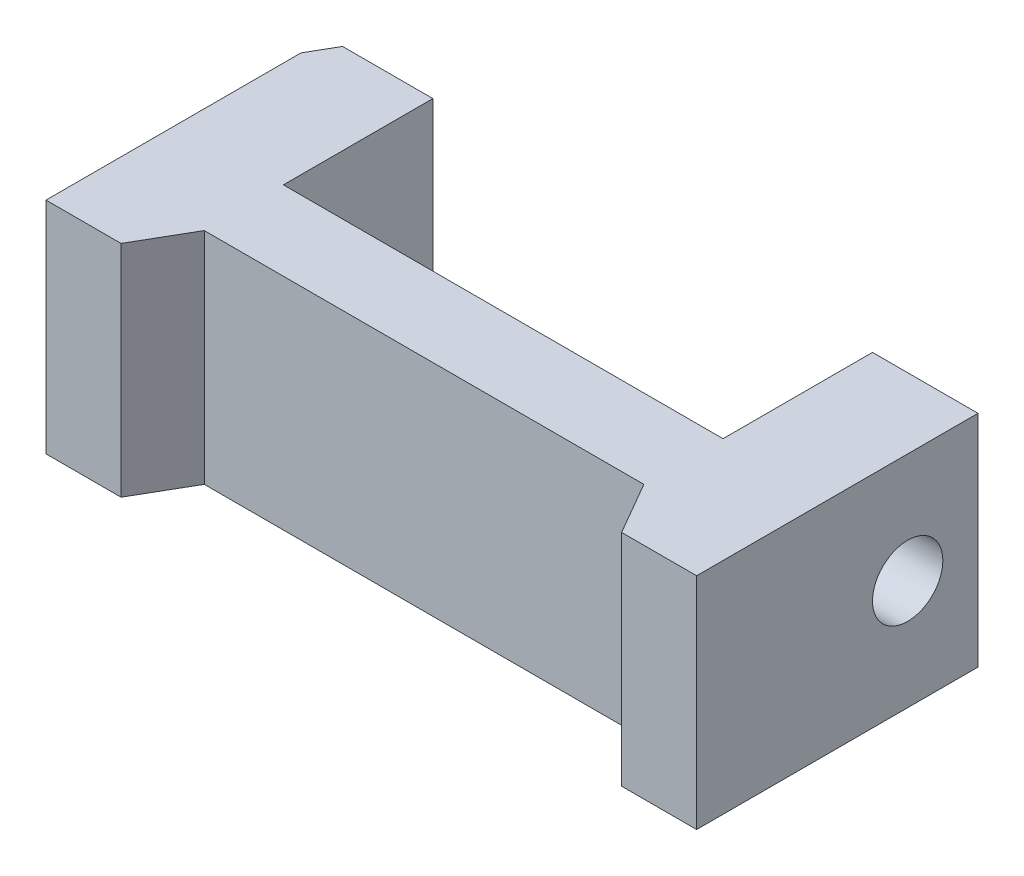
ISO-10303-21;
HEADER;
FILE_DESCRIPTION(('STEP AP214'),'2;1');
FILE_NAME('part.step','',(''),(''),'','','');
FILE_SCHEMA(('AUTOMOTIVE_DESIGN { 1 0 10303 214 1 1 1 1 }'));
ENDSEC;
DATA;
#1=APPLICATION_CONTEXT('core data for automotive mechanical design processes');
#2=APPLICATION_PROTOCOL_DEFINITION('international standard','automotive_design',2000,#1);
#3=PRODUCT_CONTEXT('',#1,'mechanical');
#4=PRODUCT('Part','Part','',(#3));
#5=PRODUCT_RELATED_PRODUCT_CATEGORY('part','',(#4));
#6=PRODUCT_DEFINITION_FORMATION('','',#4);
#7=PRODUCT_DEFINITION_CONTEXT('part definition',#1,'design');
#8=PRODUCT_DEFINITION('design','',#6,#7);
#9=PRODUCT_DEFINITION_SHAPE('','',#8);
#10=(LENGTH_UNIT() NAMED_UNIT(*) SI_UNIT(.MILLI.,.METRE.));
#11=(NAMED_UNIT(*) PLANE_ANGLE_UNIT() SI_UNIT($,.RADIAN.));
#12=(NAMED_UNIT(*) SI_UNIT($,.STERADIAN.) SOLID_ANGLE_UNIT());
#13=UNCERTAINTY_MEASURE_WITH_UNIT(LENGTH_MEASURE(1.E-05),#10,'distance_accuracy_value','');
#14=(GEOMETRIC_REPRESENTATION_CONTEXT(3) GLOBAL_UNCERTAINTY_ASSIGNED_CONTEXT((#13)) GLOBAL_UNIT_ASSIGNED_CONTEXT((#10,
#11,#12)) REPRESENTATION_CONTEXT('',''));
#15=CARTESIAN_POINT('',(0.,0.,0.));
#16=DIRECTION('',(0.,0.,1.));
#17=DIRECTION('',(1.,0.,0.));
#18=AXIS2_PLACEMENT_3D('',#15,#16,#17);
#19=CARTESIAN_POINT('',(-26.4593597471312,25.,-4.));
#20=DIRECTION('',(0.,0.,-1.));
#21=DIRECTION('',(-1.,0.,0.));
#22=AXIS2_PLACEMENT_3D('',#19,#20,#21);
#23=PLANE('',#22);
#24=DIRECTION('',(1.,0.,0.));
#25=VECTOR('',#24,1.);
#26=CARTESIAN_POINT('',(-26.4593597471312,0.,-4.));
#27=LINE('',#26,#25);
#28=CARTESIAN_POINT('',(-34.9952581319934,0.,-3.99999999999999));
#29=VERTEX_POINT('',#28);
#30=CARTESIAN_POINT('',(-26.4593597471312,0.,-4.));
#31=VERTEX_POINT('',#30);
#32=EDGE_CURVE('E170',#29,#31,#27,.T.);
#33=ORIENTED_EDGE('',*,*,#32,.T.);
#34=DIRECTION('',(0.,-1.,0.));
#35=VECTOR('',#34,1.);
#36=CARTESIAN_POINT('',(-26.4593597471312,25.,-4.));
#37=LINE('',#36,#35);
#38=CARTESIAN_POINT('',(-26.4593597471312,25.,-4.));
#39=VERTEX_POINT('',#38);
#40=EDGE_CURVE('E11',#39,#31,#37,.T.);
#41=ORIENTED_EDGE('',*,*,#40,.F.);
#42=DIRECTION('',(1.,0.,0.));
#43=VECTOR('',#42,1.);
#44=CARTESIAN_POINT('',(-26.4593597471312,25.,-4.));
#45=LINE('',#44,#43);
#46=CARTESIAN_POINT('',(-34.9952581319934,25.,-3.99999999999999));
#47=VERTEX_POINT('',#46);
#48=EDGE_CURVE('E208',#47,#39,#45,.T.);
#49=ORIENTED_EDGE('',*,*,#48,.F.);
#50=DIRECTION('',(0.,-1.,0.));
#51=VECTOR('',#50,1.);
#52=CARTESIAN_POINT('',(-34.9952581319934,25.,-3.99999999999999));
#53=LINE('',#52,#51);
#54=EDGE_CURVE('E166',#47,#29,#53,.T.);
#55=ORIENTED_EDGE('',*,*,#54,.T.);
#56=EDGE_LOOP('',(#33,#41,#49,#55));
#57=FACE_BOUND('',#56,.T.);
#58=ADVANCED_FACE('F39',(#57),#23,.F.);
#59=CARTESIAN_POINT('',(-22.9952581319934,25.,-10.));
#60=DIRECTION('',(-0.866025403784442,0.,-0.499999999999994));
#61=DIRECTION('',(-0.499999999999994,0.,0.866025403784442));
#62=AXIS2_PLACEMENT_3D('',#59,#60,#61);
#63=PLANE('',#62);
#64=DIRECTION('',(0.499999999999994,0.,-0.866025403784442));
#65=VECTOR('',#64,1.);
#66=CARTESIAN_POINT('',(-22.9952581319934,0.,-10.));
#67=LINE('',#66,#65);
#68=CARTESIAN_POINT('',(-22.9952581319934,0.,-10.));
#69=VERTEX_POINT('',#68);
#70=EDGE_CURVE('E174',#31,#69,#67,.T.);
#71=ORIENTED_EDGE('',*,*,#70,.T.);
#72=DIRECTION('',(0.,-1.,0.));
#73=VECTOR('',#72,1.);
#74=CARTESIAN_POINT('',(-22.9952581319934,25.,-10.));
#75=LINE('',#74,#73);
#76=CARTESIAN_POINT('',(-22.9952581319934,25.,-10.));
#77=VERTEX_POINT('',#76);
#78=EDGE_CURVE('E48',#77,#69,#75,.T.);
#79=ORIENTED_EDGE('',*,*,#78,.F.);
#80=DIRECTION('',(0.499999999999994,0.,-0.866025403784442));
#81=VECTOR('',#80,1.);
#82=CARTESIAN_POINT('',(-22.9952581319934,25.,-10.));
#83=LINE('',#82,#81);
#84=EDGE_CURVE('E114',#39,#77,#83,.T.);
#85=ORIENTED_EDGE('',*,*,#84,.F.);
#86=ORIENTED_EDGE('',*,*,#40,.T.);
#87=EDGE_LOOP('',(#71,#79,#85,#86));
#88=FACE_BOUND('',#87,.T.);
#89=ADVANCED_FACE('F309',(#88),#63,.F.);
#90=CARTESIAN_POINT('',(27.0047418680066,25.,-10.));
#91=DIRECTION('',(0.,0.,-1.));
#92=DIRECTION('',(-1.,0.,0.));
#93=AXIS2_PLACEMENT_3D('',#90,#91,#92);
#94=PLANE('',#93);
#95=DIRECTION('',(1.,0.,0.));
#96=VECTOR('',#95,1.);
#97=CARTESIAN_POINT('',(27.0047418680066,0.,-10.));
#98=LINE('',#97,#96);
#99=CARTESIAN_POINT('',(27.0047418680066,0.,-10.));
#100=VERTEX_POINT('',#99);
#101=EDGE_CURVE('E178',#69,#100,#98,.T.);
#102=ORIENTED_EDGE('',*,*,#101,.T.);
#103=DIRECTION('',(0.,-1.,0.));
#104=VECTOR('',#103,1.);
#105=CARTESIAN_POINT('',(27.0047418680066,25.,-10.));
#106=LINE('',#105,#104);
#107=CARTESIAN_POINT('',(27.0047418680066,25.,-10.));
#108=VERTEX_POINT('',#107);
#109=EDGE_CURVE('E239',#108,#100,#106,.T.);
#110=ORIENTED_EDGE('',*,*,#109,.F.);
#111=DIRECTION('',(1.,0.,0.));
#112=VECTOR('',#111,1.);
#113=CARTESIAN_POINT('',(27.0047418680066,25.,-10.));
#114=LINE('',#113,#112);
#115=EDGE_CURVE('E249',#77,#108,#114,.T.);
#116=ORIENTED_EDGE('',*,*,#115,.F.);
#117=ORIENTED_EDGE('',*,*,#78,.T.);
#118=EDGE_LOOP('',(#102,#110,#116,#117));
#119=FACE_BOUND('',#118,.T.);
#120=ADVANCED_FACE('F247',(#119),#94,.F.);
#121=CARTESIAN_POINT('',(30.4688434831443,25.,-4.));
#122=DIRECTION('',(0.866025403784441,0.,-0.499999999999996));
#123=DIRECTION('',(-0.499999999999996,0.,-0.866025403784441));
#124=AXIS2_PLACEMENT_3D('',#121,#122,#123);
#125=PLANE('',#124);
#126=DIRECTION('',(0.499999999999996,0.,0.866025403784441));
#127=VECTOR('',#126,1.);
#128=CARTESIAN_POINT('',(30.4688434831443,0.,-4.));
#129=LINE('',#128,#127);
#130=CARTESIAN_POINT('',(30.4688434831443,0.,-4.));
#131=VERTEX_POINT('',#130);
#132=EDGE_CURVE('E181',#100,#131,#129,.T.);
#133=ORIENTED_EDGE('',*,*,#132,.T.);
#134=DIRECTION('',(0.,-1.,0.));
#135=VECTOR('',#134,1.);
#136=CARTESIAN_POINT('',(30.4688434831443,25.,-4.));
#137=LINE('',#136,#135);
#138=CARTESIAN_POINT('',(30.4688434831443,25.,-4.));
#139=VERTEX_POINT('',#138);
#140=EDGE_CURVE('E235',#139,#131,#137,.T.);
#141=ORIENTED_EDGE('',*,*,#140,.F.);
#142=DIRECTION('',(0.499999999999996,0.,0.866025403784441));
#143=VECTOR('',#142,1.);
#144=CARTESIAN_POINT('',(30.4688434831443,25.,-4.));
#145=LINE('',#144,#143);
#146=EDGE_CURVE('E268',#108,#139,#145,.T.);
#147=ORIENTED_EDGE('',*,*,#146,.F.);
#148=ORIENTED_EDGE('',*,*,#109,.T.);
#149=EDGE_LOOP('',(#133,#141,#147,#148));
#150=FACE_BOUND('',#149,.T.);
#151=ADVANCED_FACE('F258',(#150),#125,.F.);
#152=CARTESIAN_POINT('',(39.0047418680066,25.,-4.));
#153=DIRECTION('',(0.,0.,-1.));
#154=DIRECTION('',(-1.,0.,0.));
#155=AXIS2_PLACEMENT_3D('',#152,#153,#154);
#156=PLANE('',#155);
#157=DIRECTION('',(1.,0.,0.));
#158=VECTOR('',#157,1.);
#159=CARTESIAN_POINT('',(39.0047418680066,0.,-4.));
#160=LINE('',#159,#158);
#161=CARTESIAN_POINT('',(39.0047418680066,0.,-4.));
#162=VERTEX_POINT('',#161);
#163=EDGE_CURVE('E184',#131,#162,#160,.T.);
#164=ORIENTED_EDGE('',*,*,#163,.T.);
#165=DIRECTION('',(0.,-1.,0.));
#166=VECTOR('',#165,1.);
#167=CARTESIAN_POINT('',(39.0047418680066,25.,-4.));
#168=LINE('',#167,#166);
#169=CARTESIAN_POINT('',(39.0047418680066,25.,-4.));
#170=VERTEX_POINT('',#169);
#171=EDGE_CURVE('E231',#170,#162,#168,.T.);
#172=ORIENTED_EDGE('',*,*,#171,.F.);
#173=DIRECTION('',(1.,0.,0.));
#174=VECTOR('',#173,1.);
#175=CARTESIAN_POINT('',(39.0047418680066,25.,-4.));
#176=LINE('',#175,#174);
#177=EDGE_CURVE('E264',#139,#170,#176,.T.);
#178=ORIENTED_EDGE('',*,*,#177,.F.);
#179=ORIENTED_EDGE('',*,*,#140,.T.);
#180=EDGE_LOOP('',(#164,#172,#178,#179));
#181=FACE_BOUND('',#180,.T.);
#182=ADVANCED_FACE('F262',(#181),#156,.F.);
#183=CARTESIAN_POINT('',(39.0047418680065,25.,-36.));
#184=DIRECTION('',(-1.,0.,0.));
#185=DIRECTION('',(0.,0.,1.));
#186=AXIS2_PLACEMENT_3D('',#183,#184,#185);
#187=PLANE('',#186);
#188=CARTESIAN_POINT('',(39.0047418680065,12.5,-28.));
#189=DIRECTION('',(1.,0.,0.));
#190=DIRECTION('',(0.,0.,-1.));
#191=AXIS2_PLACEMENT_3D('',#188,#189,#190);
#192=CIRCLE('',#191,3.99999999999999);
#193=CARTESIAN_POINT('',(39.0047418680065,12.5,-32.));
#194=VERTEX_POINT('',#193);
#195=EDGE_CURVE('E398',#194,#194,#192,.T.);
#196=ORIENTED_EDGE('',*,*,#195,.F.);
#197=EDGE_LOOP('',(#196));
#198=FACE_BOUND('',#197,.T.);
#199=DIRECTION('',(0.,0.,-1.));
#200=VECTOR('',#199,1.);
#201=CARTESIAN_POINT('',(39.0047418680065,0.,-36.));
#202=LINE('',#201,#200);
#203=CARTESIAN_POINT('',(39.0047418680065,0.,-36.));
#204=VERTEX_POINT('',#203);
#205=EDGE_CURVE('E187',#162,#204,#202,.T.);
#206=ORIENTED_EDGE('',*,*,#205,.T.);
#207=DIRECTION('',(0.,-1.,0.));
#208=VECTOR('',#207,1.);
#209=CARTESIAN_POINT('',(39.0047418680065,25.,-36.));
#210=LINE('',#209,#208);
#211=CARTESIAN_POINT('',(39.0047418680065,25.,-36.));
#212=VERTEX_POINT('',#211);
#213=EDGE_CURVE('E227',#212,#204,#210,.T.);
#214=ORIENTED_EDGE('',*,*,#213,.F.);
#215=DIRECTION('',(0.,0.,-1.));
#216=VECTOR('',#215,1.);
#217=CARTESIAN_POINT('',(39.0047418680065,25.,-36.));
#218=LINE('',#217,#216);
#219=EDGE_CURVE('E267',#170,#212,#218,.T.);
#220=ORIENTED_EDGE('',*,*,#219,.F.);
#221=ORIENTED_EDGE('',*,*,#171,.T.);
#222=EDGE_LOOP('',(#206,#214,#220,#221));
#223=FACE_BOUND('',#222,.T.);
#224=ADVANCED_FACE('F322',(#198,#223),#187,.F.);
#225=CARTESIAN_POINT('',(27.0047418680066,25.,-36.));
#226=DIRECTION('',(0.,0.,1.));
#227=DIRECTION('',(1.,0.,0.));
#228=AXIS2_PLACEMENT_3D('',#225,#226,#227);
#229=PLANE('',#228);
#230=DIRECTION('',(-1.,0.,0.));
#231=VECTOR('',#230,1.);
#232=CARTESIAN_POINT('',(27.0047418680066,0.,-36.));
#233=LINE('',#232,#231);
#234=CARTESIAN_POINT('',(27.0047418680066,0.,-36.));
#235=VERTEX_POINT('',#234);
#236=EDGE_CURVE('E190',#204,#235,#233,.T.);
#237=ORIENTED_EDGE('',*,*,#236,.T.);
#238=DIRECTION('',(0.,-1.,0.));
#239=VECTOR('',#238,1.);
#240=CARTESIAN_POINT('',(27.0047418680066,25.,-36.));
#241=LINE('',#240,#239);
#242=CARTESIAN_POINT('',(27.0047418680066,25.,-36.));
#243=VERTEX_POINT('',#242);
#244=EDGE_CURVE('E223',#243,#235,#241,.T.);
#245=ORIENTED_EDGE('',*,*,#244,.F.);
#246=DIRECTION('',(-1.,0.,0.));
#247=VECTOR('',#246,1.);
#248=CARTESIAN_POINT('',(27.0047418680066,25.,-36.));
#249=LINE('',#248,#247);
#250=EDGE_CURVE('E272',#212,#243,#249,.T.);
#251=ORIENTED_EDGE('',*,*,#250,.F.);
#252=ORIENTED_EDGE('',*,*,#213,.T.);
#253=EDGE_LOOP('',(#237,#245,#251,#252));
#254=FACE_BOUND('',#253,.T.);
#255=ADVANCED_FACE('F325',(#254),#229,.F.);
#256=CARTESIAN_POINT('',(27.0047418680066,25.,-19.));
#257=DIRECTION('',(1.,0.,0.));
#258=DIRECTION('',(0.,0.,-1.));
#259=AXIS2_PLACEMENT_3D('',#256,#257,#258);
#260=PLANE('',#259);
#261=CARTESIAN_POINT('',(27.0047418680066,12.5,-28.));
#262=DIRECTION('',(1.,0.,0.));
#263=DIRECTION('',(0.,0.,-1.));
#264=AXIS2_PLACEMENT_3D('',#261,#262,#263);
#265=CIRCLE('',#264,3.99999999999999);
#266=CARTESIAN_POINT('',(27.0047418680066,12.5,-32.));
#267=VERTEX_POINT('',#266);
#268=EDGE_CURVE('E175',#267,#267,#265,.T.);
#269=ORIENTED_EDGE('',*,*,#268,.T.);
#270=EDGE_LOOP('',(#269));
#271=FACE_BOUND('',#270,.T.);
#272=DIRECTION('',(0.,0.,1.));
#273=VECTOR('',#272,1.);
#274=CARTESIAN_POINT('',(27.0047418680066,0.,-19.));
#275=LINE('',#274,#273);
#276=CARTESIAN_POINT('',(27.0047418680066,0.,-19.));
#277=VERTEX_POINT('',#276);
#278=EDGE_CURVE('E193',#235,#277,#275,.T.);
#279=ORIENTED_EDGE('',*,*,#278,.T.);
#280=DIRECTION('',(0.,-1.,0.));
#281=VECTOR('',#280,1.);
#282=CARTESIAN_POINT('',(27.0047418680066,25.,-19.));
#283=LINE('',#282,#281);
#284=CARTESIAN_POINT('',(27.0047418680066,25.,-19.));
#285=VERTEX_POINT('',#284);
#286=EDGE_CURVE('E219',#285,#277,#283,.T.);
#287=ORIENTED_EDGE('',*,*,#286,.F.);
#288=DIRECTION('',(0.,0.,1.));
#289=VECTOR('',#288,1.);
#290=CARTESIAN_POINT('',(27.0047418680066,25.,-19.));
#291=LINE('',#290,#289);
#292=EDGE_CURVE('E279',#243,#285,#291,.T.);
#293=ORIENTED_EDGE('',*,*,#292,.F.);
#294=ORIENTED_EDGE('',*,*,#244,.T.);
#295=EDGE_LOOP('',(#279,#287,#293,#294));
#296=FACE_BOUND('',#295,.T.);
#297=ADVANCED_FACE('F329',(#271,#296),#260,.F.);
#298=CARTESIAN_POINT('',(-22.9952581319934,25.,-19.));
#299=DIRECTION('',(0.,0.,1.));
#300=DIRECTION('',(1.,0.,0.));
#301=AXIS2_PLACEMENT_3D('',#298,#299,#300);
#302=PLANE('',#301);
#303=DIRECTION('',(-1.,0.,0.));
#304=VECTOR('',#303,1.);
#305=CARTESIAN_POINT('',(-22.9952581319934,0.,-19.));
#306=LINE('',#305,#304);
#307=CARTESIAN_POINT('',(-22.9952581319934,0.,-19.));
#308=VERTEX_POINT('',#307);
#309=EDGE_CURVE('E196',#277,#308,#306,.T.);
#310=ORIENTED_EDGE('',*,*,#309,.T.);
#311=DIRECTION('',(0.,-1.,0.));
#312=VECTOR('',#311,1.);
#313=CARTESIAN_POINT('',(-22.9952581319934,25.,-19.));
#314=LINE('',#313,#312);
#315=CARTESIAN_POINT('',(-22.9952581319934,25.,-19.));
#316=VERTEX_POINT('',#315);
#317=EDGE_CURVE('E215',#316,#308,#314,.T.);
#318=ORIENTED_EDGE('',*,*,#317,.F.);
#319=DIRECTION('',(-1.,0.,0.));
#320=VECTOR('',#319,1.);
#321=CARTESIAN_POINT('',(-22.9952581319934,25.,-19.));
#322=LINE('',#321,#320);
#323=EDGE_CURVE('E282',#285,#316,#322,.T.);
#324=ORIENTED_EDGE('',*,*,#323,.F.);
#325=ORIENTED_EDGE('',*,*,#286,.T.);
#326=EDGE_LOOP('',(#310,#318,#324,#325));
#327=FACE_BOUND('',#326,.T.);
#328=ADVANCED_FACE('F290',(#327),#302,.F.);
#329=CARTESIAN_POINT('',(-22.9952581319934,25.,-36.));
#330=DIRECTION('',(-1.,0.,0.));
#331=DIRECTION('',(0.,0.,1.));
#332=AXIS2_PLACEMENT_3D('',#329,#330,#331);
#333=PLANE('',#332);
#334=DIRECTION('',(0.,0.,-1.));
#335=VECTOR('',#334,1.);
#336=CARTESIAN_POINT('',(-22.9952581319934,0.,-36.));
#337=LINE('',#336,#335);
#338=CARTESIAN_POINT('',(-22.9952581319934,0.,-36.));
#339=VERTEX_POINT('',#338);
#340=EDGE_CURVE('E199',#308,#339,#337,.T.);
#341=ORIENTED_EDGE('',*,*,#340,.T.);
#342=DIRECTION('',(0.,-1.,0.));
#343=VECTOR('',#342,1.);
#344=CARTESIAN_POINT('',(-22.9952581319934,25.,-36.));
#345=LINE('',#344,#343);
#346=CARTESIAN_POINT('',(-22.9952581319934,25.,-36.));
#347=VERTEX_POINT('',#346);
#348=EDGE_CURVE('E159',#347,#339,#345,.T.);
#349=ORIENTED_EDGE('',*,*,#348,.F.);
#350=DIRECTION('',(0.,0.,-1.));
#351=VECTOR('',#350,1.);
#352=CARTESIAN_POINT('',(-22.9952581319934,25.,-36.));
#353=LINE('',#352,#351);
#354=EDGE_CURVE('E148',#316,#347,#353,.T.);
#355=ORIENTED_EDGE('',*,*,#354,.F.);
#356=ORIENTED_EDGE('',*,*,#317,.T.);
#357=EDGE_LOOP('',(#341,#349,#355,#356));
#358=FACE_BOUND('',#357,.T.);
#359=ADVANCED_FACE('F294',(#358),#333,.F.);
#360=CARTESIAN_POINT('',(-33.2632073244246,25.,-36.));
#361=DIRECTION('',(0.,0.,1.));
#362=DIRECTION('',(1.,0.,0.));
#363=AXIS2_PLACEMENT_3D('',#360,#361,#362);
#364=PLANE('',#363);
#365=DIRECTION('',(-1.,0.,0.));
#366=VECTOR('',#365,1.);
#367=CARTESIAN_POINT('',(-33.2632073244246,0.,-36.));
#368=LINE('',#367,#366);
#369=CARTESIAN_POINT('',(-33.2632073244246,0.,-36.));
#370=VERTEX_POINT('',#369);
#371=EDGE_CURVE('E157',#339,#370,#368,.T.);
#372=ORIENTED_EDGE('',*,*,#371,.T.);
#373=DIRECTION('',(0.,-1.,0.));
#374=VECTOR('',#373,1.);
#375=CARTESIAN_POINT('',(-33.2632073244246,25.,-36.));
#376=LINE('',#375,#374);
#377=CARTESIAN_POINT('',(-33.2632073244246,25.,-36.));
#378=VERTEX_POINT('',#377);
#379=EDGE_CURVE('E154',#378,#370,#376,.T.);
#380=ORIENTED_EDGE('',*,*,#379,.F.);
#381=DIRECTION('',(-1.,0.,0.));
#382=VECTOR('',#381,1.);
#383=CARTESIAN_POINT('',(-33.2632073244246,25.,-36.));
#384=LINE('',#383,#382);
#385=EDGE_CURVE('E142',#347,#378,#384,.T.);
#386=ORIENTED_EDGE('',*,*,#385,.F.);
#387=ORIENTED_EDGE('',*,*,#348,.T.);
#388=EDGE_LOOP('',(#372,#380,#386,#387));
#389=FACE_BOUND('',#388,.T.);
#390=ADVANCED_FACE('F155',(#389),#364,.F.);
#391=CARTESIAN_POINT('',(-34.9952581319934,25.,-33.));
#392=DIRECTION('',(0.866025403784442,0.,0.499999999999994));
#393=DIRECTION('',(0.499999999999994,0.,-0.866025403784442));
#394=AXIS2_PLACEMENT_3D('',#391,#392,#393);
#395=PLANE('',#394);
#396=DIRECTION('',(-0.499999999999994,0.,0.866025403784442));
#397=VECTOR('',#396,1.);
#398=CARTESIAN_POINT('',(-34.9952581319934,0.,-33.));
#399=LINE('',#398,#397);
#400=CARTESIAN_POINT('',(-34.9952581319934,0.,-33.));
#401=VERTEX_POINT('',#400);
#402=EDGE_CURVE('E100',#370,#401,#399,.T.);
#403=ORIENTED_EDGE('',*,*,#402,.T.);
#404=DIRECTION('',(0.,-1.,0.));
#405=VECTOR('',#404,1.);
#406=CARTESIAN_POINT('',(-34.9952581319934,25.,-33.));
#407=LINE('',#406,#405);
#408=CARTESIAN_POINT('',(-34.9952581319934,25.,-33.));
#409=VERTEX_POINT('',#408);
#410=EDGE_CURVE('E160',#409,#401,#407,.T.);
#411=ORIENTED_EDGE('',*,*,#410,.F.);
#412=DIRECTION('',(-0.499999999999994,0.,0.866025403784442));
#413=VECTOR('',#412,1.);
#414=CARTESIAN_POINT('',(-34.9952581319934,25.,-33.));
#415=LINE('',#414,#413);
#416=EDGE_CURVE('E146',#378,#409,#415,.T.);
#417=ORIENTED_EDGE('',*,*,#416,.F.);
#418=ORIENTED_EDGE('',*,*,#379,.T.);
#419=EDGE_LOOP('',(#403,#411,#417,#418));
#420=FACE_BOUND('',#419,.T.);
#421=ADVANCED_FACE('F162',(#420),#395,.F.);
#422=CARTESIAN_POINT('',(-34.9952581319934,25.,-3.99999999999999));
#423=DIRECTION('',(1.,0.,0.));
#424=DIRECTION('',(0.,0.,-1.));
#425=AXIS2_PLACEMENT_3D('',#422,#423,#424);
#426=PLANE('',#425);
#427=DIRECTION('',(0.,0.,1.));
#428=VECTOR('',#427,1.);
#429=CARTESIAN_POINT('',(-34.9952581319934,0.,-3.99999999999999));
#430=LINE('',#429,#428);
#431=EDGE_CURVE('E106',#401,#29,#430,.T.);
#432=ORIENTED_EDGE('',*,*,#431,.T.);
#433=ORIENTED_EDGE('',*,*,#54,.F.);
#434=DIRECTION('',(0.,0.,1.));
#435=VECTOR('',#434,1.);
#436=CARTESIAN_POINT('',(-34.9952581319934,25.,-3.99999999999999));
#437=LINE('',#436,#435);
#438=EDGE_CURVE('E56',#409,#47,#437,.T.);
#439=ORIENTED_EDGE('',*,*,#438,.F.);
#440=ORIENTED_EDGE('',*,*,#410,.T.);
#441=EDGE_LOOP('',(#432,#433,#439,#440));
#442=FACE_BOUND('',#441,.T.);
#443=ADVANCED_FACE('F298',(#442),#426,.F.);
#444=CARTESIAN_POINT('',(0.,25.,0.));
#445=DIRECTION('',(0.,-1.,0.));
#446=DIRECTION('',(0.,0.,-1.));
#447=AXIS2_PLACEMENT_3D('',#444,#445,#446);
#448=PLANE('',#447);
#449=ORIENTED_EDGE('',*,*,#48,.T.);
#450=ORIENTED_EDGE('',*,*,#84,.T.);
#451=ORIENTED_EDGE('',*,*,#115,.T.);
#452=ORIENTED_EDGE('',*,*,#146,.T.);
#453=ORIENTED_EDGE('',*,*,#177,.T.);
#454=ORIENTED_EDGE('',*,*,#219,.T.);
#455=ORIENTED_EDGE('',*,*,#250,.T.);
#456=ORIENTED_EDGE('',*,*,#292,.T.);
#457=ORIENTED_EDGE('',*,*,#323,.T.);
#458=ORIENTED_EDGE('',*,*,#354,.T.);
#459=ORIENTED_EDGE('',*,*,#385,.T.);
#460=ORIENTED_EDGE('',*,*,#416,.T.);
#461=ORIENTED_EDGE('',*,*,#438,.T.);
#462=EDGE_LOOP('',(#449,#450,#451,#452,#453,#454,#455,#456,#457,#458,#459,#460,#461));
#463=FACE_BOUND('',#462,.T.);
#464=ADVANCED_FACE('F144',(#463),#448,.F.);
#465=CARTESIAN_POINT('',(0.,0.,0.));
#466=DIRECTION('',(0.,-1.,0.));
#467=DIRECTION('',(0.,0.,-1.));
#468=AXIS2_PLACEMENT_3D('',#465,#466,#467);
#469=PLANE('',#468);
#470=ORIENTED_EDGE('',*,*,#32,.F.);
#471=ORIENTED_EDGE('',*,*,#431,.F.);
#472=ORIENTED_EDGE('',*,*,#402,.F.);
#473=ORIENTED_EDGE('',*,*,#371,.F.);
#474=ORIENTED_EDGE('',*,*,#340,.F.);
#475=ORIENTED_EDGE('',*,*,#309,.F.);
#476=ORIENTED_EDGE('',*,*,#278,.F.);
#477=ORIENTED_EDGE('',*,*,#236,.F.);
#478=ORIENTED_EDGE('',*,*,#205,.F.);
#479=ORIENTED_EDGE('',*,*,#163,.F.);
#480=ORIENTED_EDGE('',*,*,#132,.F.);
#481=ORIENTED_EDGE('',*,*,#101,.F.);
#482=ORIENTED_EDGE('',*,*,#70,.F.);
#483=EDGE_LOOP('',(#470,#471,#472,#473,#474,#475,#476,#477,#478,#479,#480,#481,#482));
#484=FACE_BOUND('',#483,.T.);
#485=ADVANCED_FACE('F253',(#484),#469,.T.);
#486=CARTESIAN_POINT('',(39.0047418680065,12.5,-28.));
#487=DIRECTION('',(1.,0.,0.));
#488=DIRECTION('',(0.,0.,-1.));
#489=AXIS2_PLACEMENT_3D('',#486,#487,#488);
#490=CYLINDRICAL_SURFACE('',#489,3.99999999999999);
#491=ORIENTED_EDGE('',*,*,#268,.F.);
#492=EDGE_LOOP('',(#491));
#493=FACE_BOUND('',#492,.T.);
#494=ORIENTED_EDGE('',*,*,#195,.T.);
#495=EDGE_LOOP('',(#494));
#496=FACE_BOUND('',#495,.T.);
#497=ADVANCED_FACE('F366',(#493,#496),#490,.F.);
#498=CLOSED_SHELL('',(#58,#89,#120,#151,#182,#224,#255,#297,#328,#359,#390,#421,#443,#464,#485,#497));
#499=MANIFOLD_SOLID_BREP('B2',#498);
#500=ADVANCED_BREP_SHAPE_REPRESENTATION('',(#18,#499),#14);
#501=SHAPE_DEFINITION_REPRESENTATION(#9,#500);
ENDSEC;
END-ISO-10303-21;
